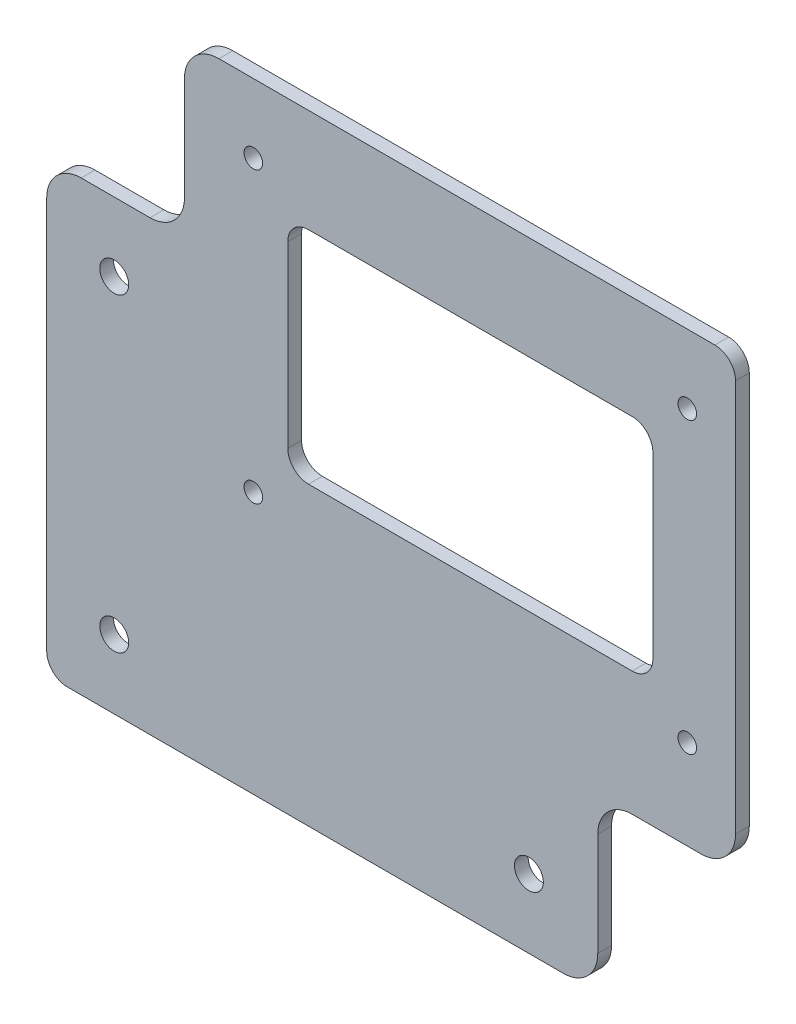
ISO-10303-21;
HEADER;
FILE_DESCRIPTION(('STEP AP214'),'2;1');
FILE_NAME('part.step','',(''),(''),'','','');
FILE_SCHEMA(('AUTOMOTIVE_DESIGN { 1 0 10303 214 1 1 1 1 }'));
ENDSEC;
DATA;
#1=APPLICATION_CONTEXT('core data for automotive mechanical design processes');
#2=APPLICATION_PROTOCOL_DEFINITION('international standard','automotive_design',2000,#1);
#3=PRODUCT_CONTEXT('',#1,'mechanical');
#4=PRODUCT('Part','Part','',(#3));
#5=PRODUCT_RELATED_PRODUCT_CATEGORY('part','',(#4));
#6=PRODUCT_DEFINITION_FORMATION('','',#4);
#7=PRODUCT_DEFINITION_CONTEXT('part definition',#1,'design');
#8=PRODUCT_DEFINITION('design','',#6,#7);
#9=PRODUCT_DEFINITION_SHAPE('','',#8);
#10=(LENGTH_UNIT() NAMED_UNIT(*) SI_UNIT(.MILLI.,.METRE.));
#11=(NAMED_UNIT(*) PLANE_ANGLE_UNIT() SI_UNIT($,.RADIAN.));
#12=(NAMED_UNIT(*) SI_UNIT($,.STERADIAN.) SOLID_ANGLE_UNIT());
#13=UNCERTAINTY_MEASURE_WITH_UNIT(LENGTH_MEASURE(1.E-05),#10,'distance_accuracy_value','');
#14=(GEOMETRIC_REPRESENTATION_CONTEXT(3) GLOBAL_UNCERTAINTY_ASSIGNED_CONTEXT((#13)) GLOBAL_UNIT_ASSIGNED_CONTEXT((#10,
#11,#12)) REPRESENTATION_CONTEXT('',''));
#15=CARTESIAN_POINT('',(0.,0.,0.));
#16=DIRECTION('',(0.,0.,1.));
#17=DIRECTION('',(1.,0.,0.));
#18=AXIS2_PLACEMENT_3D('',#15,#16,#17);
#19=CARTESIAN_POINT('',(0.,0.,2.));
#20=DIRECTION('',(1.,0.,0.));
#21=DIRECTION('',(0.,1.,0.));
#22=AXIS2_PLACEMENT_3D('',#19,#20,#21);
#23=PLANE('',#22);
#24=DIRECTION('',(0.,-1.,0.));
#25=VECTOR('',#24,1.);
#26=CARTESIAN_POINT('',(0.,0.,2.));
#27=LINE('',#26,#25);
#28=CARTESIAN_POINT('',(0.,60.,2.));
#29=VERTEX_POINT('',#28);
#30=CARTESIAN_POINT('',(0.,3.,2.));
#31=VERTEX_POINT('',#30);
#32=EDGE_CURVE('E308',#29,#31,#27,.T.);
#33=ORIENTED_EDGE('',*,*,#32,.F.);
#34=DIRECTION('',(0.,0.,1.));
#35=VECTOR('',#34,1.);
#36=CARTESIAN_POINT('',(0.,60.,2.));
#37=LINE('',#36,#35);
#38=CARTESIAN_POINT('',(0.,60.,0.));
#39=VERTEX_POINT('',#38);
#40=EDGE_CURVE('E402',#29,#39,#37,.F.);
#41=ORIENTED_EDGE('',*,*,#40,.T.);
#42=DIRECTION('',(0.,-1.,0.));
#43=VECTOR('',#42,1.);
#44=CARTESIAN_POINT('',(0.,0.,0.));
#45=LINE('',#44,#43);
#46=CARTESIAN_POINT('',(0.,3.,0.));
#47=VERTEX_POINT('',#46);
#48=EDGE_CURVE('E305',#39,#47,#45,.T.);
#49=ORIENTED_EDGE('',*,*,#48,.T.);
#50=DIRECTION('',(0.,0.,-1.));
#51=VECTOR('',#50,1.);
#52=CARTESIAN_POINT('',(0.,3.,2.));
#53=LINE('',#52,#51);
#54=EDGE_CURVE('E319',#47,#31,#53,.F.);
#55=ORIENTED_EDGE('',*,*,#54,.T.);
#56=EDGE_LOOP('',(#33,#41,#49,#55));
#57=FACE_BOUND('',#56,.T.);
#58=ADVANCED_FACE('F41',(#57),#23,.F.);
#59=CARTESIAN_POINT('',(0.,0.,2.));
#60=DIRECTION('',(0.,1.,0.));
#61=DIRECTION('',(0.,0.,1.));
#62=AXIS2_PLACEMENT_3D('',#59,#60,#61);
#63=PLANE('',#62);
#64=DIRECTION('',(1.,0.,0.));
#65=VECTOR('',#64,1.);
#66=CARTESIAN_POINT('',(0.,0.,0.));
#67=LINE('',#66,#65);
#68=CARTESIAN_POINT('',(3.,0.,0.));
#69=VERTEX_POINT('',#68);
#70=CARTESIAN_POINT('',(75.,0.,0.));
#71=VERTEX_POINT('',#70);
#72=EDGE_CURVE('E321',#69,#71,#67,.T.);
#73=ORIENTED_EDGE('',*,*,#72,.T.);
#74=DIRECTION('',(0.,0.,1.));
#75=VECTOR('',#74,1.);
#76=CARTESIAN_POINT('',(75.,0.,2.));
#77=LINE('',#76,#75);
#78=CARTESIAN_POINT('',(75.,0.,2.));
#79=VERTEX_POINT('',#78);
#80=EDGE_CURVE('E360',#71,#79,#77,.T.);
#81=ORIENTED_EDGE('',*,*,#80,.T.);
#82=DIRECTION('',(1.,0.,0.));
#83=VECTOR('',#82,1.);
#84=CARTESIAN_POINT('',(0.,0.,2.));
#85=LINE('',#84,#83);
#86=CARTESIAN_POINT('',(3.,0.,2.));
#87=VERTEX_POINT('',#86);
#88=EDGE_CURVE('E310',#87,#79,#85,.T.);
#89=ORIENTED_EDGE('',*,*,#88,.F.);
#90=DIRECTION('',(0.,0.,-1.));
#91=VECTOR('',#90,1.);
#92=CARTESIAN_POINT('',(3.,0.,2.));
#93=LINE('',#92,#91);
#94=EDGE_CURVE('E346',#87,#69,#93,.T.);
#95=ORIENTED_EDGE('',*,*,#94,.T.);
#96=EDGE_LOOP('',(#73,#81,#89,#95));
#97=FACE_BOUND('',#96,.T.);
#98=ADVANCED_FACE('F510',(#97),#63,.F.);
#99=CARTESIAN_POINT('',(100.,0.,2.));
#100=DIRECTION('',(-1.,0.,0.));
#101=DIRECTION('',(0.,-1.,0.));
#102=AXIS2_PLACEMENT_3D('',#99,#100,#101);
#103=PLANE('',#102);
#104=DIRECTION('',(0.,1.,0.));
#105=VECTOR('',#104,1.);
#106=CARTESIAN_POINT('',(100.,0.,2.));
#107=LINE('',#106,#105);
#108=CARTESIAN_POINT('',(100.,30.,2.));
#109=VERTEX_POINT('',#108);
#110=CARTESIAN_POINT('',(100.,87.,2.));
#111=VERTEX_POINT('',#110);
#112=EDGE_CURVE('E314',#109,#111,#107,.T.);
#113=ORIENTED_EDGE('',*,*,#112,.F.);
#114=DIRECTION('',(0.,0.,1.));
#115=VECTOR('',#114,1.);
#116=CARTESIAN_POINT('',(100.,30.,2.));
#117=LINE('',#116,#115);
#118=CARTESIAN_POINT('',(100.,30.,0.));
#119=VERTEX_POINT('',#118);
#120=EDGE_CURVE('E388',#109,#119,#117,.F.);
#121=ORIENTED_EDGE('',*,*,#120,.T.);
#122=DIRECTION('',(0.,1.,0.));
#123=VECTOR('',#122,1.);
#124=CARTESIAN_POINT('',(100.,0.,0.));
#125=LINE('',#124,#123);
#126=CARTESIAN_POINT('',(100.,87.,0.));
#127=VERTEX_POINT('',#126);
#128=EDGE_CURVE('E324',#119,#127,#125,.T.);
#129=ORIENTED_EDGE('',*,*,#128,.T.);
#130=DIRECTION('',(0.,0.,-1.));
#131=VECTOR('',#130,1.);
#132=CARTESIAN_POINT('',(100.,87.,2.));
#133=LINE('',#132,#131);
#134=EDGE_CURVE('E343',#127,#111,#133,.F.);
#135=ORIENTED_EDGE('',*,*,#134,.T.);
#136=EDGE_LOOP('',(#113,#121,#129,#135));
#137=FACE_BOUND('',#136,.T.);
#138=ADVANCED_FACE('F517',(#137),#103,.F.);
#139=CARTESIAN_POINT('',(0.,90.,2.));
#140=DIRECTION('',(0.,-1.,0.));
#141=DIRECTION('',(0.,0.,-1.));
#142=AXIS2_PLACEMENT_3D('',#139,#140,#141);
#143=PLANE('',#142);
#144=DIRECTION('',(-1.,0.,0.));
#145=VECTOR('',#144,1.);
#146=CARTESIAN_POINT('',(0.,90.,0.));
#147=LINE('',#146,#145);
#148=CARTESIAN_POINT('',(97.,90.,0.));
#149=VERTEX_POINT('',#148);
#150=CARTESIAN_POINT('',(25.,90.,0.));
#151=VERTEX_POINT('',#150);
#152=EDGE_CURVE('E311',#149,#151,#147,.T.);
#153=ORIENTED_EDGE('',*,*,#152,.T.);
#154=DIRECTION('',(0.,0.,1.));
#155=VECTOR('',#154,1.);
#156=CARTESIAN_POINT('',(25.,90.,2.));
#157=LINE('',#156,#155);
#158=CARTESIAN_POINT('',(25.,90.,2.));
#159=VERTEX_POINT('',#158);
#160=EDGE_CURVE('E390',#151,#159,#157,.T.);
#161=ORIENTED_EDGE('',*,*,#160,.T.);
#162=DIRECTION('',(-1.,0.,0.));
#163=VECTOR('',#162,1.);
#164=CARTESIAN_POINT('',(0.,90.,2.));
#165=LINE('',#164,#163);
#166=CARTESIAN_POINT('',(97.,90.,2.));
#167=VERTEX_POINT('',#166);
#168=EDGE_CURVE('E316',#167,#159,#165,.T.);
#169=ORIENTED_EDGE('',*,*,#168,.F.);
#170=DIRECTION('',(0.,0.,-1.));
#171=VECTOR('',#170,1.);
#172=CARTESIAN_POINT('',(97.,90.,2.));
#173=LINE('',#172,#171);
#174=EDGE_CURVE('E336',#167,#149,#173,.T.);
#175=ORIENTED_EDGE('',*,*,#174,.T.);
#176=EDGE_LOOP('',(#153,#161,#169,#175));
#177=FACE_BOUND('',#176,.T.);
#178=ADVANCED_FACE('F432',(#177),#143,.F.);
#179=CARTESIAN_POINT('',(0.,0.,2.));
#180=DIRECTION('',(0.,0.,-1.));
#181=DIRECTION('',(-1.,0.,0.));
#182=AXIS2_PLACEMENT_3D('',#179,#180,#181);
#183=PLANE('',#182);
#184=DIRECTION('',(1.,0.,0.));
#185=VECTOR('',#184,1.);
#186=CARTESIAN_POINT('',(38.,43.,2.));
#187=LINE('',#186,#185);
#188=CARTESIAN_POINT('',(38.,43.,2.));
#189=VERTEX_POINT('',#188);
#190=CARTESIAN_POINT('',(85.,43.,2.));
#191=VERTEX_POINT('',#190);
#192=EDGE_CURVE('E252',#189,#191,#187,.T.);
#193=ORIENTED_EDGE('',*,*,#192,.F.);
#194=CARTESIAN_POINT('',(38.,46.,2.));
#195=DIRECTION('',(0.,0.,1.));
#196=DIRECTION('',(-1.,0.,0.));
#197=AXIS2_PLACEMENT_3D('',#194,#195,#196);
#198=CIRCLE('',#197,3.00000000000001);
#199=CARTESIAN_POINT('',(35.,46.,2.));
#200=VERTEX_POINT('',#199);
#201=EDGE_CURVE('E210',#200,#189,#198,.T.);
#202=ORIENTED_EDGE('',*,*,#201,.F.);
#203=DIRECTION('',(0.,-1.,0.));
#204=VECTOR('',#203,1.);
#205=CARTESIAN_POINT('',(35.,72.,2.));
#206=LINE('',#205,#204);
#207=CARTESIAN_POINT('',(35.,72.,2.));
#208=VERTEX_POINT('',#207);
#209=EDGE_CURVE('E229',#208,#200,#206,.T.);
#210=ORIENTED_EDGE('',*,*,#209,.F.);
#211=CARTESIAN_POINT('',(38.,72.,2.));
#212=DIRECTION('',(0.,0.,1.));
#213=DIRECTION('',(1.,0.,0.));
#214=AXIS2_PLACEMENT_3D('',#211,#212,#213);
#215=CIRCLE('',#214,3.);
#216=CARTESIAN_POINT('',(38.,75.,2.));
#217=VERTEX_POINT('',#216);
#218=EDGE_CURVE('E232',#217,#208,#215,.T.);
#219=ORIENTED_EDGE('',*,*,#218,.F.);
#220=DIRECTION('',(-1.,0.,0.));
#221=VECTOR('',#220,1.);
#222=CARTESIAN_POINT('',(38.,75.,2.));
#223=LINE('',#222,#221);
#224=CARTESIAN_POINT('',(85.,75.,2.));
#225=VERTEX_POINT('',#224);
#226=EDGE_CURVE('E264',#225,#217,#223,.T.);
#227=ORIENTED_EDGE('',*,*,#226,.F.);
#228=CARTESIAN_POINT('',(85.,72.,2.));
#229=DIRECTION('',(0.,0.,1.));
#230=DIRECTION('',(1.,0.,0.));
#231=AXIS2_PLACEMENT_3D('',#228,#229,#230);
#232=CIRCLE('',#231,3.);
#233=CARTESIAN_POINT('',(88.,72.,2.));
#234=VERTEX_POINT('',#233);
#235=EDGE_CURVE('E261',#234,#225,#232,.T.);
#236=ORIENTED_EDGE('',*,*,#235,.F.);
#237=DIRECTION('',(0.,1.,0.));
#238=VECTOR('',#237,1.);
#239=CARTESIAN_POINT('',(88.,72.,2.));
#240=LINE('',#239,#238);
#241=CARTESIAN_POINT('',(88.,46.,2.));
#242=VERTEX_POINT('',#241);
#243=EDGE_CURVE('E258',#242,#234,#240,.T.);
#244=ORIENTED_EDGE('',*,*,#243,.F.);
#245=CARTESIAN_POINT('',(85.,46.,2.));
#246=DIRECTION('',(0.,0.,1.));
#247=DIRECTION('',(1.,0.,0.));
#248=AXIS2_PLACEMENT_3D('',#245,#246,#247);
#249=CIRCLE('',#248,3.00000000000001);
#250=EDGE_CURVE('E255',#191,#242,#249,.T.);
#251=ORIENTED_EDGE('',*,*,#250,.F.);
#252=EDGE_LOOP('',(#193,#202,#210,#219,#227,#236,#244,#251));
#253=FACE_BOUND('',#252,.T.);
#254=CARTESIAN_POINT('',(30.,38.,2.));
#255=DIRECTION('',(0.,0.,1.));
#256=DIRECTION('',(1.,0.,0.));
#257=AXIS2_PLACEMENT_3D('',#254,#255,#256);
#258=CIRCLE('',#257,1.35000000000001);
#259=CARTESIAN_POINT('',(31.35,38.,2.));
#260=VERTEX_POINT('',#259);
#261=EDGE_CURVE('E235',#260,#260,#258,.T.);
#262=ORIENTED_EDGE('',*,*,#261,.F.);
#263=EDGE_LOOP('',(#262));
#264=FACE_BOUND('',#263,.T.);
#265=CARTESIAN_POINT('',(93.,38.,2.));
#266=DIRECTION('',(0.,0.,1.));
#267=DIRECTION('',(1.,0.,0.));
#268=AXIS2_PLACEMENT_3D('',#265,#266,#267);
#269=CIRCLE('',#268,1.35000000000001);
#270=CARTESIAN_POINT('',(94.35,38.,2.));
#271=VERTEX_POINT('',#270);
#272=EDGE_CURVE('E468',#271,#271,#269,.T.);
#273=ORIENTED_EDGE('',*,*,#272,.F.);
#274=EDGE_LOOP('',(#273));
#275=FACE_BOUND('',#274,.T.);
#276=CARTESIAN_POINT('',(93.,80.,2.));
#277=DIRECTION('',(0.,0.,1.));
#278=DIRECTION('',(1.,0.,0.));
#279=AXIS2_PLACEMENT_3D('',#276,#277,#278);
#280=CIRCLE('',#279,1.35000000000001);
#281=CARTESIAN_POINT('',(94.35,80.,2.));
#282=VERTEX_POINT('',#281);
#283=EDGE_CURVE('E462',#282,#282,#280,.T.);
#284=ORIENTED_EDGE('',*,*,#283,.F.);
#285=EDGE_LOOP('',(#284));
#286=FACE_BOUND('',#285,.T.);
#287=CARTESIAN_POINT('',(30.,80.,2.));
#288=DIRECTION('',(0.,0.,1.));
#289=DIRECTION('',(1.,0.,0.));
#290=AXIS2_PLACEMENT_3D('',#287,#288,#289);
#291=CIRCLE('',#290,1.35000000000001);
#292=CARTESIAN_POINT('',(31.35,80.,2.));
#293=VERTEX_POINT('',#292);
#294=EDGE_CURVE('E286',#293,#293,#291,.T.);
#295=ORIENTED_EDGE('',*,*,#294,.F.);
#296=EDGE_LOOP('',(#295));
#297=FACE_BOUND('',#296,.T.);
#298=CARTESIAN_POINT('',(70.,10.,2.));
#299=DIRECTION('',(0.,0.,1.));
#300=DIRECTION('',(1.,0.,0.));
#301=AXIS2_PLACEMENT_3D('',#298,#299,#300);
#302=CIRCLE('',#301,2.09999999999999);
#303=CARTESIAN_POINT('',(72.1,10.,2.));
#304=VERTEX_POINT('',#303);
#305=EDGE_CURVE('E285',#304,#304,#302,.T.);
#306=ORIENTED_EDGE('',*,*,#305,.F.);
#307=EDGE_LOOP('',(#306));
#308=FACE_BOUND('',#307,.T.);
#309=CARTESIAN_POINT('',(9.79999999999997,55.,2.));
#310=DIRECTION('',(0.,0.,1.));
#311=DIRECTION('',(1.,0.,0.));
#312=AXIS2_PLACEMENT_3D('',#309,#310,#311);
#313=CIRCLE('',#312,2.1);
#314=CARTESIAN_POINT('',(11.9,55.,2.));
#315=VERTEX_POINT('',#314);
#316=EDGE_CURVE('E294',#315,#315,#313,.T.);
#317=ORIENTED_EDGE('',*,*,#316,.F.);
#318=EDGE_LOOP('',(#317));
#319=FACE_BOUND('',#318,.T.);
#320=CARTESIAN_POINT('',(9.79999999999997,9.99999999999999,2.));
#321=DIRECTION('',(0.,0.,1.));
#322=DIRECTION('',(1.,0.,0.));
#323=AXIS2_PLACEMENT_3D('',#320,#321,#322);
#324=CIRCLE('',#323,2.1);
#325=CARTESIAN_POINT('',(11.9,9.99999999999999,2.));
#326=VERTEX_POINT('',#325);
#327=EDGE_CURVE('E293',#326,#326,#324,.T.);
#328=ORIENTED_EDGE('',*,*,#327,.F.);
#329=EDGE_LOOP('',(#328));
#330=FACE_BOUND('',#329,.T.);
#331=ORIENTED_EDGE('',*,*,#88,.T.);
#332=CARTESIAN_POINT('',(75.,5.,2.));
#333=DIRECTION('',(0.,0.,-1.));
#334=DIRECTION('',(-1.,0.,0.));
#335=AXIS2_PLACEMENT_3D('',#332,#333,#334);
#336=CIRCLE('',#335,5.);
#337=CARTESIAN_POINT('',(80.,5.,2.));
#338=VERTEX_POINT('',#337);
#339=EDGE_CURVE('E369',#79,#338,#336,.F.);
#340=ORIENTED_EDGE('',*,*,#339,.T.);
#341=DIRECTION('',(0.,-1.,0.));
#342=VECTOR('',#341,1.);
#343=CARTESIAN_POINT('',(80.,25.,2.));
#344=LINE('',#343,#342);
#345=CARTESIAN_POINT('',(80.,20.,2.));
#346=VERTEX_POINT('',#345);
#347=EDGE_CURVE('E454',#346,#338,#344,.T.);
#348=ORIENTED_EDGE('',*,*,#347,.F.);
#349=CARTESIAN_POINT('',(85.,20.,2.));
#350=DIRECTION('',(0.,0.,-1.));
#351=DIRECTION('',(-1.,0.,0.));
#352=AXIS2_PLACEMENT_3D('',#349,#350,#351);
#353=CIRCLE('',#352,5.);
#354=CARTESIAN_POINT('',(85.,25.,2.));
#355=VERTEX_POINT('',#354);
#356=EDGE_CURVE('E404',#346,#355,#353,.T.);
#357=ORIENTED_EDGE('',*,*,#356,.T.);
#358=DIRECTION('',(-1.,0.,0.));
#359=VECTOR('',#358,1.);
#360=CARTESIAN_POINT('',(100.,25.,2.));
#361=LINE('',#360,#359);
#362=CARTESIAN_POINT('',(95.,25.,2.));
#363=VERTEX_POINT('',#362);
#364=EDGE_CURVE('E417',#363,#355,#361,.T.);
#365=ORIENTED_EDGE('',*,*,#364,.F.);
#366=CARTESIAN_POINT('',(95.,30.,2.));
#367=DIRECTION('',(0.,0.,-1.));
#368=DIRECTION('',(-1.,0.,0.));
#369=AXIS2_PLACEMENT_3D('',#366,#367,#368);
#370=CIRCLE('',#369,5.);
#371=EDGE_CURVE('E367',#363,#109,#370,.F.);
#372=ORIENTED_EDGE('',*,*,#371,.T.);
#373=ORIENTED_EDGE('',*,*,#112,.T.);
#374=CARTESIAN_POINT('',(97.,87.,2.));
#375=DIRECTION('',(0.,0.,-1.));
#376=DIRECTION('',(-1.,0.,0.));
#377=AXIS2_PLACEMENT_3D('',#374,#375,#376);
#378=CIRCLE('',#377,3.);
#379=EDGE_CURVE('E341',#111,#167,#378,.F.);
#380=ORIENTED_EDGE('',*,*,#379,.T.);
#381=ORIENTED_EDGE('',*,*,#168,.T.);
#382=CARTESIAN_POINT('',(25.,85.,2.));
#383=DIRECTION('',(0.,0.,-1.));
#384=DIRECTION('',(-1.,0.,0.));
#385=AXIS2_PLACEMENT_3D('',#382,#383,#384);
#386=CIRCLE('',#385,5.);
#387=CARTESIAN_POINT('',(20.,85.,2.));
#388=VERTEX_POINT('',#387);
#389=EDGE_CURVE('E365',#159,#388,#386,.F.);
#390=ORIENTED_EDGE('',*,*,#389,.T.);
#391=DIRECTION('',(0.,1.,0.));
#392=VECTOR('',#391,1.);
#393=CARTESIAN_POINT('',(20.,90.,2.));
#394=LINE('',#393,#392);
#395=CARTESIAN_POINT('',(20.,70.,2.));
#396=VERTEX_POINT('',#395);
#397=EDGE_CURVE('E253',#396,#388,#394,.T.);
#398=ORIENTED_EDGE('',*,*,#397,.F.);
#399=CARTESIAN_POINT('',(15.,70.,2.));
#400=DIRECTION('',(0.,0.,-1.));
#401=DIRECTION('',(-1.,0.,0.));
#402=AXIS2_PLACEMENT_3D('',#399,#400,#401);
#403=CIRCLE('',#402,5.);
#404=CARTESIAN_POINT('',(15.,65.,2.));
#405=VERTEX_POINT('',#404);
#406=EDGE_CURVE('E49',#396,#405,#403,.T.);
#407=ORIENTED_EDGE('',*,*,#406,.T.);
#408=DIRECTION('',(1.,0.,0.));
#409=VECTOR('',#408,1.);
#410=CARTESIAN_POINT('',(0.,65.,2.));
#411=LINE('',#410,#409);
#412=CARTESIAN_POINT('',(4.99999999999999,65.,2.));
#413=VERTEX_POINT('',#412);
#414=EDGE_CURVE('E411',#413,#405,#411,.T.);
#415=ORIENTED_EDGE('',*,*,#414,.F.);
#416=CARTESIAN_POINT('',(4.99999999999999,60.,2.));
#417=DIRECTION('',(0.,0.,-1.));
#418=DIRECTION('',(-1.,0.,0.));
#419=AXIS2_PLACEMENT_3D('',#416,#417,#418);
#420=CIRCLE('',#419,5.);
#421=EDGE_CURVE('E363',#413,#29,#420,.F.);
#422=ORIENTED_EDGE('',*,*,#421,.T.);
#423=ORIENTED_EDGE('',*,*,#32,.T.);
#424=CARTESIAN_POINT('',(3.,3.,2.));
#425=DIRECTION('',(0.,0.,-1.));
#426=DIRECTION('',(-1.,0.,0.));
#427=AXIS2_PLACEMENT_3D('',#424,#425,#426);
#428=CIRCLE('',#427,3.);
#429=EDGE_CURVE('E339',#31,#87,#428,.F.);
#430=ORIENTED_EDGE('',*,*,#429,.T.);
#431=EDGE_LOOP('',(#331,#340,#348,#357,#365,#372,#373,#380,#381,#390,#398,#407,#415,#422,#423,#430));
#432=FACE_BOUND('',#431,.T.);
#433=ADVANCED_FACE('F410',(#253,#264,#275,#286,#297,#308,#319,#330,#432),#183,.F.);
#434=CARTESIAN_POINT('',(0.,0.,0.));
#435=DIRECTION('',(0.,0.,-1.));
#436=DIRECTION('',(-1.,0.,0.));
#437=AXIS2_PLACEMENT_3D('',#434,#435,#436);
#438=PLANE('',#437);
#439=DIRECTION('',(0.,1.,0.));
#440=VECTOR('',#439,1.);
#441=CARTESIAN_POINT('',(80.,0.,0.));
#442=LINE('',#441,#440);
#443=CARTESIAN_POINT('',(80.,5.,0.));
#444=VERTEX_POINT('',#443);
#445=CARTESIAN_POINT('',(80.,20.,0.));
#446=VERTEX_POINT('',#445);
#447=EDGE_CURVE('E352',#444,#446,#442,.T.);
#448=ORIENTED_EDGE('',*,*,#447,.F.);
#449=CARTESIAN_POINT('',(75.,5.,0.));
#450=DIRECTION('',(0.,0.,-1.));
#451=DIRECTION('',(-1.,0.,0.));
#452=AXIS2_PLACEMENT_3D('',#449,#450,#451);
#453=CIRCLE('',#452,5.);
#454=EDGE_CURVE('E381',#444,#71,#453,.T.);
#455=ORIENTED_EDGE('',*,*,#454,.T.);
#456=ORIENTED_EDGE('',*,*,#72,.F.);
#457=CARTESIAN_POINT('',(3.,3.,0.));
#458=DIRECTION('',(0.,0.,-1.));
#459=DIRECTION('',(-1.,0.,0.));
#460=AXIS2_PLACEMENT_3D('',#457,#458,#459);
#461=CIRCLE('',#460,3.);
#462=EDGE_CURVE('E330',#69,#47,#461,.T.);
#463=ORIENTED_EDGE('',*,*,#462,.T.);
#464=ORIENTED_EDGE('',*,*,#48,.F.);
#465=CARTESIAN_POINT('',(4.99999999999999,60.,0.));
#466=DIRECTION('',(0.,0.,-1.));
#467=DIRECTION('',(-1.,0.,0.));
#468=AXIS2_PLACEMENT_3D('',#465,#466,#467);
#469=CIRCLE('',#468,5.);
#470=CARTESIAN_POINT('',(4.99999999999999,65.,0.));
#471=VERTEX_POINT('',#470);
#472=EDGE_CURVE('E56',#39,#471,#469,.T.);
#473=ORIENTED_EDGE('',*,*,#472,.T.);
#474=DIRECTION('',(-1.,0.,0.));
#475=VECTOR('',#474,1.);
#476=CARTESIAN_POINT('',(0.,65.,0.));
#477=LINE('',#476,#475);
#478=CARTESIAN_POINT('',(15.,65.,0.));
#479=VERTEX_POINT('',#478);
#480=EDGE_CURVE('E355',#479,#471,#477,.T.);
#481=ORIENTED_EDGE('',*,*,#480,.F.);
#482=CARTESIAN_POINT('',(15.,70.,0.));
#483=DIRECTION('',(0.,0.,-1.));
#484=DIRECTION('',(-1.,0.,0.));
#485=AXIS2_PLACEMENT_3D('',#482,#483,#484);
#486=CIRCLE('',#485,5.);
#487=CARTESIAN_POINT('',(20.,70.,0.));
#488=VERTEX_POINT('',#487);
#489=EDGE_CURVE('E11',#479,#488,#486,.F.);
#490=ORIENTED_EDGE('',*,*,#489,.T.);
#491=DIRECTION('',(0.,-1.,0.));
#492=VECTOR('',#491,1.);
#493=CARTESIAN_POINT('',(20.,0.,0.));
#494=LINE('',#493,#492);
#495=CARTESIAN_POINT('',(20.,85.,0.));
#496=VERTEX_POINT('',#495);
#497=EDGE_CURVE('E357',#496,#488,#494,.T.);
#498=ORIENTED_EDGE('',*,*,#497,.F.);
#499=CARTESIAN_POINT('',(25.,85.,0.));
#500=DIRECTION('',(0.,0.,-1.));
#501=DIRECTION('',(-1.,0.,0.));
#502=AXIS2_PLACEMENT_3D('',#499,#500,#501);
#503=CIRCLE('',#502,5.);
#504=EDGE_CURVE('E377',#496,#151,#503,.T.);
#505=ORIENTED_EDGE('',*,*,#504,.T.);
#506=ORIENTED_EDGE('',*,*,#152,.F.);
#507=CARTESIAN_POINT('',(97.,87.,0.));
#508=DIRECTION('',(0.,0.,-1.));
#509=DIRECTION('',(-1.,0.,0.));
#510=AXIS2_PLACEMENT_3D('',#507,#508,#509);
#511=CIRCLE('',#510,3.);
#512=EDGE_CURVE('E333',#149,#127,#511,.T.);
#513=ORIENTED_EDGE('',*,*,#512,.T.);
#514=ORIENTED_EDGE('',*,*,#128,.F.);
#515=CARTESIAN_POINT('',(95.,30.,0.));
#516=DIRECTION('',(0.,0.,-1.));
#517=DIRECTION('',(-1.,0.,0.));
#518=AXIS2_PLACEMENT_3D('',#515,#516,#517);
#519=CIRCLE('',#518,5.);
#520=CARTESIAN_POINT('',(95.,25.,0.));
#521=VERTEX_POINT('',#520);
#522=EDGE_CURVE('E379',#119,#521,#519,.T.);
#523=ORIENTED_EDGE('',*,*,#522,.T.);
#524=DIRECTION('',(1.,0.,0.));
#525=VECTOR('',#524,1.);
#526=CARTESIAN_POINT('',(0.,25.,0.));
#527=LINE('',#526,#525);
#528=CARTESIAN_POINT('',(85.,25.,0.));
#529=VERTEX_POINT('',#528);
#530=EDGE_CURVE('E349',#529,#521,#527,.T.);
#531=ORIENTED_EDGE('',*,*,#530,.F.);
#532=CARTESIAN_POINT('',(85.,20.,0.));
#533=DIRECTION('',(0.,0.,-1.));
#534=DIRECTION('',(-1.,0.,0.));
#535=AXIS2_PLACEMENT_3D('',#532,#533,#534);
#536=CIRCLE('',#535,5.);
#537=EDGE_CURVE('E406',#529,#446,#536,.F.);
#538=ORIENTED_EDGE('',*,*,#537,.T.);
#539=EDGE_LOOP('',(#448,#455,#456,#463,#464,#473,#481,#490,#498,#505,#506,#513,#514,#523,#531,#538));
#540=FACE_BOUND('',#539,.T.);
#541=CARTESIAN_POINT('',(38.,46.,0.));
#542=DIRECTION('',(0.,0.,1.));
#543=DIRECTION('',(-1.,0.,0.));
#544=AXIS2_PLACEMENT_3D('',#541,#542,#543);
#545=CIRCLE('',#544,3.00000000000001);
#546=CARTESIAN_POINT('',(35.,46.,0.));
#547=VERTEX_POINT('',#546);
#548=CARTESIAN_POINT('',(38.,43.,0.));
#549=VERTEX_POINT('',#548);
#550=EDGE_CURVE('E207',#547,#549,#545,.T.);
#551=ORIENTED_EDGE('',*,*,#550,.T.);
#552=DIRECTION('',(1.,0.,0.));
#553=VECTOR('',#552,1.);
#554=CARTESIAN_POINT('',(38.,43.,0.));
#555=LINE('',#554,#553);
#556=CARTESIAN_POINT('',(85.,43.,0.));
#557=VERTEX_POINT('',#556);
#558=EDGE_CURVE('E219',#549,#557,#555,.T.);
#559=ORIENTED_EDGE('',*,*,#558,.T.);
#560=CARTESIAN_POINT('',(85.,46.,0.));
#561=DIRECTION('',(0.,0.,1.));
#562=DIRECTION('',(1.,0.,0.));
#563=AXIS2_PLACEMENT_3D('',#560,#561,#562);
#564=CIRCLE('',#563,3.00000000000001);
#565=CARTESIAN_POINT('',(88.,46.,0.));
#566=VERTEX_POINT('',#565);
#567=EDGE_CURVE('E223',#557,#566,#564,.T.);
#568=ORIENTED_EDGE('',*,*,#567,.T.);
#569=DIRECTION('',(0.,1.,0.));
#570=VECTOR('',#569,1.);
#571=CARTESIAN_POINT('',(88.,72.,0.));
#572=LINE('',#571,#570);
#573=CARTESIAN_POINT('',(88.,72.,0.));
#574=VERTEX_POINT('',#573);
#575=EDGE_CURVE('E239',#566,#574,#572,.T.);
#576=ORIENTED_EDGE('',*,*,#575,.T.);
#577=CARTESIAN_POINT('',(85.,72.,0.));
#578=DIRECTION('',(0.,0.,1.));
#579=DIRECTION('',(1.,0.,0.));
#580=AXIS2_PLACEMENT_3D('',#577,#578,#579);
#581=CIRCLE('',#580,3.);
#582=CARTESIAN_POINT('',(85.,75.,0.));
#583=VERTEX_POINT('',#582);
#584=EDGE_CURVE('E242',#574,#583,#581,.T.);
#585=ORIENTED_EDGE('',*,*,#584,.T.);
#586=DIRECTION('',(-1.,0.,0.));
#587=VECTOR('',#586,1.);
#588=CARTESIAN_POINT('',(38.,75.,0.));
#589=LINE('',#588,#587);
#590=CARTESIAN_POINT('',(38.,75.,0.));
#591=VERTEX_POINT('',#590);
#592=EDGE_CURVE('E245',#583,#591,#589,.T.);
#593=ORIENTED_EDGE('',*,*,#592,.T.);
#594=CARTESIAN_POINT('',(38.,72.,0.));
#595=DIRECTION('',(0.,0.,1.));
#596=DIRECTION('',(1.,0.,0.));
#597=AXIS2_PLACEMENT_3D('',#594,#595,#596);
#598=CIRCLE('',#597,3.);
#599=CARTESIAN_POINT('',(35.,72.,0.));
#600=VERTEX_POINT('',#599);
#601=EDGE_CURVE('E248',#591,#600,#598,.T.);
#602=ORIENTED_EDGE('',*,*,#601,.T.);
#603=DIRECTION('',(0.,-1.,0.));
#604=VECTOR('',#603,1.);
#605=CARTESIAN_POINT('',(35.,72.,0.));
#606=LINE('',#605,#604);
#607=EDGE_CURVE('E215',#600,#547,#606,.T.);
#608=ORIENTED_EDGE('',*,*,#607,.T.);
#609=EDGE_LOOP('',(#551,#559,#568,#576,#585,#593,#602,#608));
#610=FACE_BOUND('',#609,.T.);
#611=CARTESIAN_POINT('',(30.,38.,0.));
#612=DIRECTION('',(0.,0.,1.));
#613=DIRECTION('',(1.,0.,0.));
#614=AXIS2_PLACEMENT_3D('',#611,#612,#613);
#615=CIRCLE('',#614,1.35000000000001);
#616=CARTESIAN_POINT('',(31.35,38.,0.));
#617=VERTEX_POINT('',#616);
#618=EDGE_CURVE('E470',#617,#617,#615,.T.);
#619=ORIENTED_EDGE('',*,*,#618,.T.);
#620=EDGE_LOOP('',(#619));
#621=FACE_BOUND('',#620,.T.);
#622=CARTESIAN_POINT('',(93.,38.,0.));
#623=DIRECTION('',(0.,0.,1.));
#624=DIRECTION('',(1.,0.,0.));
#625=AXIS2_PLACEMENT_3D('',#622,#623,#624);
#626=CIRCLE('',#625,1.35000000000001);
#627=CARTESIAN_POINT('',(94.35,38.,0.));
#628=VERTEX_POINT('',#627);
#629=EDGE_CURVE('E465',#628,#628,#626,.T.);
#630=ORIENTED_EDGE('',*,*,#629,.T.);
#631=EDGE_LOOP('',(#630));
#632=FACE_BOUND('',#631,.T.);
#633=CARTESIAN_POINT('',(93.,80.,0.));
#634=DIRECTION('',(0.,0.,1.));
#635=DIRECTION('',(1.,0.,0.));
#636=AXIS2_PLACEMENT_3D('',#633,#634,#635);
#637=CIRCLE('',#636,1.35000000000001);
#638=CARTESIAN_POINT('',(94.35,80.,0.));
#639=VERTEX_POINT('',#638);
#640=EDGE_CURVE('E289',#639,#639,#637,.T.);
#641=ORIENTED_EDGE('',*,*,#640,.T.);
#642=EDGE_LOOP('',(#641));
#643=FACE_BOUND('',#642,.T.);
#644=CARTESIAN_POINT('',(30.,80.,0.));
#645=DIRECTION('',(0.,0.,1.));
#646=DIRECTION('',(1.,0.,0.));
#647=AXIS2_PLACEMENT_3D('',#644,#645,#646);
#648=CIRCLE('',#647,1.35000000000001);
#649=CARTESIAN_POINT('',(31.35,80.,0.));
#650=VERTEX_POINT('',#649);
#651=EDGE_CURVE('E282',#650,#650,#648,.T.);
#652=ORIENTED_EDGE('',*,*,#651,.T.);
#653=EDGE_LOOP('',(#652));
#654=FACE_BOUND('',#653,.T.);
#655=CARTESIAN_POINT('',(70.,10.,0.));
#656=DIRECTION('',(0.,0.,1.));
#657=DIRECTION('',(1.,0.,0.));
#658=AXIS2_PLACEMENT_3D('',#655,#656,#657);
#659=CIRCLE('',#658,2.09999999999999);
#660=CARTESIAN_POINT('',(72.1,10.,0.));
#661=VERTEX_POINT('',#660);
#662=EDGE_CURVE('E297',#661,#661,#659,.T.);
#663=ORIENTED_EDGE('',*,*,#662,.T.);
#664=EDGE_LOOP('',(#663));
#665=FACE_BOUND('',#664,.T.);
#666=CARTESIAN_POINT('',(9.79999999999997,55.,0.));
#667=DIRECTION('',(0.,0.,1.));
#668=DIRECTION('',(1.,0.,0.));
#669=AXIS2_PLACEMENT_3D('',#666,#667,#668);
#670=CIRCLE('',#669,2.1);
#671=CARTESIAN_POINT('',(11.9,55.,0.));
#672=VERTEX_POINT('',#671);
#673=EDGE_CURVE('E290',#672,#672,#670,.T.);
#674=ORIENTED_EDGE('',*,*,#673,.T.);
#675=EDGE_LOOP('',(#674));
#676=FACE_BOUND('',#675,.T.);
#677=CARTESIAN_POINT('',(9.79999999999997,9.99999999999999,0.));
#678=DIRECTION('',(0.,0.,1.));
#679=DIRECTION('',(1.,0.,0.));
#680=AXIS2_PLACEMENT_3D('',#677,#678,#679);
#681=CIRCLE('',#680,2.1);
#682=CARTESIAN_POINT('',(11.9,9.99999999999999,0.));
#683=VERTEX_POINT('',#682);
#684=EDGE_CURVE('E302',#683,#683,#681,.T.);
#685=ORIENTED_EDGE('',*,*,#684,.T.);
#686=EDGE_LOOP('',(#685));
#687=FACE_BOUND('',#686,.T.);
#688=ADVANCED_FACE('F225',(#540,#610,#621,#632,#643,#654,#665,#676,#687),#438,.T.);
#689=CARTESIAN_POINT('',(9.79999999999997,9.99999999999999,0.));
#690=DIRECTION('',(0.,0.,1.));
#691=DIRECTION('',(1.,0.,0.));
#692=AXIS2_PLACEMENT_3D('',#689,#690,#691);
#693=CYLINDRICAL_SURFACE('',#692,2.1);
#694=ORIENTED_EDGE('',*,*,#684,.F.);
#695=EDGE_LOOP('',(#694));
#696=FACE_BOUND('',#695,.T.);
#697=ORIENTED_EDGE('',*,*,#327,.T.);
#698=EDGE_LOOP('',(#697));
#699=FACE_BOUND('',#698,.T.);
#700=ADVANCED_FACE('F494',(#696,#699),#693,.F.);
#701=CARTESIAN_POINT('',(9.79999999999997,55.,0.));
#702=DIRECTION('',(0.,0.,1.));
#703=DIRECTION('',(1.,0.,0.));
#704=AXIS2_PLACEMENT_3D('',#701,#702,#703);
#705=CYLINDRICAL_SURFACE('',#704,2.1);
#706=ORIENTED_EDGE('',*,*,#673,.F.);
#707=EDGE_LOOP('',(#706));
#708=FACE_BOUND('',#707,.T.);
#709=ORIENTED_EDGE('',*,*,#316,.T.);
#710=EDGE_LOOP('',(#709));
#711=FACE_BOUND('',#710,.T.);
#712=ADVANCED_FACE('F496',(#708,#711),#705,.F.);
#713=CARTESIAN_POINT('',(70.,10.,0.));
#714=DIRECTION('',(0.,0.,1.));
#715=DIRECTION('',(1.,0.,0.));
#716=AXIS2_PLACEMENT_3D('',#713,#714,#715);
#717=CYLINDRICAL_SURFACE('',#716,2.09999999999999);
#718=ORIENTED_EDGE('',*,*,#662,.F.);
#719=EDGE_LOOP('',(#718));
#720=FACE_BOUND('',#719,.T.);
#721=ORIENTED_EDGE('',*,*,#305,.T.);
#722=EDGE_LOOP('',(#721));
#723=FACE_BOUND('',#722,.T.);
#724=ADVANCED_FACE('F502',(#720,#723),#717,.F.);
#725=CARTESIAN_POINT('',(30.,80.,0.));
#726=DIRECTION('',(0.,0.,1.));
#727=DIRECTION('',(1.,0.,0.));
#728=AXIS2_PLACEMENT_3D('',#725,#726,#727);
#729=CYLINDRICAL_SURFACE('',#728,1.35000000000001);
#730=ORIENTED_EDGE('',*,*,#651,.F.);
#731=EDGE_LOOP('',(#730));
#732=FACE_BOUND('',#731,.T.);
#733=ORIENTED_EDGE('',*,*,#294,.T.);
#734=EDGE_LOOP('',(#733));
#735=FACE_BOUND('',#734,.T.);
#736=ADVANCED_FACE('F571',(#732,#735),#729,.F.);
#737=CARTESIAN_POINT('',(93.,80.,0.));
#738=DIRECTION('',(0.,0.,1.));
#739=DIRECTION('',(1.,0.,0.));
#740=AXIS2_PLACEMENT_3D('',#737,#738,#739);
#741=CYLINDRICAL_SURFACE('',#740,1.35000000000001);
#742=ORIENTED_EDGE('',*,*,#640,.F.);
#743=EDGE_LOOP('',(#742));
#744=FACE_BOUND('',#743,.T.);
#745=ORIENTED_EDGE('',*,*,#283,.T.);
#746=EDGE_LOOP('',(#745));
#747=FACE_BOUND('',#746,.T.);
#748=ADVANCED_FACE('F567',(#744,#747),#741,.F.);
#749=CARTESIAN_POINT('',(93.,38.,0.));
#750=DIRECTION('',(0.,0.,1.));
#751=DIRECTION('',(1.,0.,0.));
#752=AXIS2_PLACEMENT_3D('',#749,#750,#751);
#753=CYLINDRICAL_SURFACE('',#752,1.35000000000001);
#754=ORIENTED_EDGE('',*,*,#629,.F.);
#755=EDGE_LOOP('',(#754));
#756=FACE_BOUND('',#755,.T.);
#757=ORIENTED_EDGE('',*,*,#272,.T.);
#758=EDGE_LOOP('',(#757));
#759=FACE_BOUND('',#758,.T.);
#760=ADVANCED_FACE('F570',(#756,#759),#753,.F.);
#761=CARTESIAN_POINT('',(30.,38.,0.));
#762=DIRECTION('',(0.,0.,1.));
#763=DIRECTION('',(1.,0.,0.));
#764=AXIS2_PLACEMENT_3D('',#761,#762,#763);
#765=CYLINDRICAL_SURFACE('',#764,1.35000000000001);
#766=ORIENTED_EDGE('',*,*,#618,.F.);
#767=EDGE_LOOP('',(#766));
#768=FACE_BOUND('',#767,.T.);
#769=ORIENTED_EDGE('',*,*,#261,.T.);
#770=EDGE_LOOP('',(#769));
#771=FACE_BOUND('',#770,.T.);
#772=ADVANCED_FACE('F476',(#768,#771),#765,.F.);
#773=CARTESIAN_POINT('',(38.,46.,0.));
#774=DIRECTION('',(0.,0.,1.));
#775=DIRECTION('',(1.,0.,0.));
#776=AXIS2_PLACEMENT_3D('',#773,#774,#775);
#777=CYLINDRICAL_SURFACE('',#776,3.00000000000001);
#778=ORIENTED_EDGE('',*,*,#201,.T.);
#779=DIRECTION('',(0.,0.,1.));
#780=VECTOR('',#779,1.);
#781=CARTESIAN_POINT('',(38.,43.,0.));
#782=LINE('',#781,#780);
#783=EDGE_CURVE('E203',#549,#189,#782,.T.);
#784=ORIENTED_EDGE('',*,*,#783,.F.);
#785=ORIENTED_EDGE('',*,*,#550,.F.);
#786=DIRECTION('',(0.,0.,1.));
#787=VECTOR('',#786,1.);
#788=CARTESIAN_POINT('',(35.,46.,0.));
#789=LINE('',#788,#787);
#790=EDGE_CURVE('E269',#547,#200,#789,.T.);
#791=ORIENTED_EDGE('',*,*,#790,.T.);
#792=EDGE_LOOP('',(#778,#784,#785,#791));
#793=FACE_BOUND('',#792,.T.);
#794=ADVANCED_FACE('F205',(#793),#777,.F.);
#795=CARTESIAN_POINT('',(35.,72.,0.));
#796=DIRECTION('',(-1.,0.,0.));
#797=DIRECTION('',(0.,0.,1.));
#798=AXIS2_PLACEMENT_3D('',#795,#796,#797);
#799=PLANE('',#798);
#800=ORIENTED_EDGE('',*,*,#209,.T.);
#801=ORIENTED_EDGE('',*,*,#790,.F.);
#802=ORIENTED_EDGE('',*,*,#607,.F.);
#803=DIRECTION('',(0.,0.,1.));
#804=VECTOR('',#803,1.);
#805=CARTESIAN_POINT('',(35.,72.,0.));
#806=LINE('',#805,#804);
#807=EDGE_CURVE('E271',#600,#208,#806,.T.);
#808=ORIENTED_EDGE('',*,*,#807,.T.);
#809=EDGE_LOOP('',(#800,#801,#802,#808));
#810=FACE_BOUND('',#809,.T.);
#811=ADVANCED_FACE('F579',(#810),#799,.F.);
#812=CARTESIAN_POINT('',(38.,72.,0.));
#813=DIRECTION('',(0.,0.,1.));
#814=DIRECTION('',(1.,0.,0.));
#815=AXIS2_PLACEMENT_3D('',#812,#813,#814);
#816=CYLINDRICAL_SURFACE('',#815,3.);
#817=ORIENTED_EDGE('',*,*,#218,.T.);
#818=ORIENTED_EDGE('',*,*,#807,.F.);
#819=ORIENTED_EDGE('',*,*,#601,.F.);
#820=DIRECTION('',(0.,0.,1.));
#821=VECTOR('',#820,1.);
#822=CARTESIAN_POINT('',(38.,75.,0.));
#823=LINE('',#822,#821);
#824=EDGE_CURVE('E273',#591,#217,#823,.T.);
#825=ORIENTED_EDGE('',*,*,#824,.T.);
#826=EDGE_LOOP('',(#817,#818,#819,#825));
#827=FACE_BOUND('',#826,.T.);
#828=ADVANCED_FACE('F582',(#827),#816,.F.);
#829=CARTESIAN_POINT('',(38.,75.,0.));
#830=DIRECTION('',(0.,1.,0.));
#831=DIRECTION('',(0.,0.,1.));
#832=AXIS2_PLACEMENT_3D('',#829,#830,#831);
#833=PLANE('',#832);
#834=ORIENTED_EDGE('',*,*,#226,.T.);
#835=ORIENTED_EDGE('',*,*,#824,.F.);
#836=ORIENTED_EDGE('',*,*,#592,.F.);
#837=DIRECTION('',(0.,0.,1.));
#838=VECTOR('',#837,1.);
#839=CARTESIAN_POINT('',(85.,75.,0.));
#840=LINE('',#839,#838);
#841=EDGE_CURVE('E275',#583,#225,#840,.T.);
#842=ORIENTED_EDGE('',*,*,#841,.T.);
#843=EDGE_LOOP('',(#834,#835,#836,#842));
#844=FACE_BOUND('',#843,.T.);
#845=ADVANCED_FACE('F586',(#844),#833,.F.);
#846=CARTESIAN_POINT('',(85.,72.,0.));
#847=DIRECTION('',(0.,0.,1.));
#848=DIRECTION('',(1.,0.,0.));
#849=AXIS2_PLACEMENT_3D('',#846,#847,#848);
#850=CYLINDRICAL_SURFACE('',#849,3.);
#851=ORIENTED_EDGE('',*,*,#235,.T.);
#852=ORIENTED_EDGE('',*,*,#841,.F.);
#853=ORIENTED_EDGE('',*,*,#584,.F.);
#854=DIRECTION('',(0.,0.,1.));
#855=VECTOR('',#854,1.);
#856=CARTESIAN_POINT('',(88.,72.,0.));
#857=LINE('',#856,#855);
#858=EDGE_CURVE('E277',#574,#234,#857,.T.);
#859=ORIENTED_EDGE('',*,*,#858,.T.);
#860=EDGE_LOOP('',(#851,#852,#853,#859));
#861=FACE_BOUND('',#860,.T.);
#862=ADVANCED_FACE('F590',(#861),#850,.F.);
#863=CARTESIAN_POINT('',(88.,72.,0.));
#864=DIRECTION('',(1.,0.,0.));
#865=DIRECTION('',(0.,0.,-1.));
#866=AXIS2_PLACEMENT_3D('',#863,#864,#865);
#867=PLANE('',#866);
#868=ORIENTED_EDGE('',*,*,#243,.T.);
#869=ORIENTED_EDGE('',*,*,#858,.F.);
#870=ORIENTED_EDGE('',*,*,#575,.F.);
#871=DIRECTION('',(0.,0.,1.));
#872=VECTOR('',#871,1.);
#873=CARTESIAN_POINT('',(88.,46.,0.));
#874=LINE('',#873,#872);
#875=EDGE_CURVE('E279',#566,#242,#874,.T.);
#876=ORIENTED_EDGE('',*,*,#875,.T.);
#877=EDGE_LOOP('',(#868,#869,#870,#876));
#878=FACE_BOUND('',#877,.T.);
#879=ADVANCED_FACE('F594',(#878),#867,.F.);
#880=CARTESIAN_POINT('',(85.,46.,0.));
#881=DIRECTION('',(0.,0.,1.));
#882=DIRECTION('',(1.,0.,0.));
#883=AXIS2_PLACEMENT_3D('',#880,#881,#882);
#884=CYLINDRICAL_SURFACE('',#883,3.00000000000001);
#885=ORIENTED_EDGE('',*,*,#250,.T.);
#886=ORIENTED_EDGE('',*,*,#875,.F.);
#887=ORIENTED_EDGE('',*,*,#567,.F.);
#888=DIRECTION('',(0.,0.,1.));
#889=VECTOR('',#888,1.);
#890=CARTESIAN_POINT('',(85.,43.,0.));
#891=LINE('',#890,#889);
#892=EDGE_CURVE('E214',#557,#191,#891,.T.);
#893=ORIENTED_EDGE('',*,*,#892,.T.);
#894=EDGE_LOOP('',(#885,#886,#887,#893));
#895=FACE_BOUND('',#894,.T.);
#896=ADVANCED_FACE('F598',(#895),#884,.F.);
#897=CARTESIAN_POINT('',(38.,43.,0.));
#898=DIRECTION('',(0.,-1.,0.));
#899=DIRECTION('',(0.,0.,-1.));
#900=AXIS2_PLACEMENT_3D('',#897,#898,#899);
#901=PLANE('',#900);
#902=ORIENTED_EDGE('',*,*,#192,.T.);
#903=ORIENTED_EDGE('',*,*,#892,.F.);
#904=ORIENTED_EDGE('',*,*,#558,.F.);
#905=ORIENTED_EDGE('',*,*,#783,.T.);
#906=EDGE_LOOP('',(#902,#903,#904,#905));
#907=FACE_BOUND('',#906,.T.);
#908=ADVANCED_FACE('F220',(#907),#901,.F.);
#909=CARTESIAN_POINT('',(97.,87.,2.));
#910=DIRECTION('',(0.,0.,-1.));
#911=DIRECTION('',(-1.,0.,0.));
#912=AXIS2_PLACEMENT_3D('',#909,#910,#911);
#913=CYLINDRICAL_SURFACE('',#912,3.);
#914=ORIENTED_EDGE('',*,*,#379,.F.);
#915=ORIENTED_EDGE('',*,*,#134,.F.);
#916=ORIENTED_EDGE('',*,*,#512,.F.);
#917=ORIENTED_EDGE('',*,*,#174,.F.);
#918=EDGE_LOOP('',(#914,#915,#916,#917));
#919=FACE_BOUND('',#918,.T.);
#920=ADVANCED_FACE('F437',(#919),#913,.T.);
#921=CARTESIAN_POINT('',(3.,3.,2.));
#922=DIRECTION('',(0.,0.,-1.));
#923=DIRECTION('',(-1.,0.,0.));
#924=AXIS2_PLACEMENT_3D('',#921,#922,#923);
#925=CYLINDRICAL_SURFACE('',#924,3.);
#926=ORIENTED_EDGE('',*,*,#429,.F.);
#927=ORIENTED_EDGE('',*,*,#54,.F.);
#928=ORIENTED_EDGE('',*,*,#462,.F.);
#929=ORIENTED_EDGE('',*,*,#94,.F.);
#930=EDGE_LOOP('',(#926,#927,#928,#929));
#931=FACE_BOUND('',#930,.T.);
#932=ADVANCED_FACE('F525',(#931),#925,.T.);
#933=CARTESIAN_POINT('',(80.,25.,-8.));
#934=DIRECTION('',(-1.,0.,0.));
#935=DIRECTION('',(0.,0.,1.));
#936=AXIS2_PLACEMENT_3D('',#933,#934,#935);
#937=PLANE('',#936);
#938=ORIENTED_EDGE('',*,*,#347,.T.);
#939=DIRECTION('',(0.,0.,1.));
#940=VECTOR('',#939,1.);
#941=CARTESIAN_POINT('',(80.,5.,-8.));
#942=LINE('',#941,#940);
#943=EDGE_CURVE('E374',#338,#444,#942,.F.);
#944=ORIENTED_EDGE('',*,*,#943,.T.);
#945=ORIENTED_EDGE('',*,*,#447,.T.);
#946=DIRECTION('',(0.,0.,1.));
#947=VECTOR('',#946,1.);
#948=CARTESIAN_POINT('',(80.,20.,2.));
#949=LINE('',#948,#947);
#950=EDGE_CURVE('E371',#446,#346,#949,.T.);
#951=ORIENTED_EDGE('',*,*,#950,.T.);
#952=EDGE_LOOP('',(#938,#944,#945,#951));
#953=FACE_BOUND('',#952,.T.);
#954=ADVANCED_FACE('F527',(#953),#937,.F.);
#955=CARTESIAN_POINT('',(100.,25.,-8.));
#956=DIRECTION('',(0.,1.,0.));
#957=DIRECTION('',(-1.,0.,0.));
#958=AXIS2_PLACEMENT_3D('',#955,#956,#957);
#959=PLANE('',#958);
#960=ORIENTED_EDGE('',*,*,#530,.T.);
#961=DIRECTION('',(0.,0.,1.));
#962=VECTOR('',#961,1.);
#963=CARTESIAN_POINT('',(95.,25.,-8.));
#964=LINE('',#963,#962);
#965=EDGE_CURVE('E385',#521,#363,#964,.T.);
#966=ORIENTED_EDGE('',*,*,#965,.T.);
#967=ORIENTED_EDGE('',*,*,#364,.T.);
#968=DIRECTION('',(0.,0.,1.));
#969=VECTOR('',#968,1.);
#970=CARTESIAN_POINT('',(85.,25.,0.));
#971=LINE('',#970,#969);
#972=EDGE_CURVE('E383',#355,#529,#971,.F.);
#973=ORIENTED_EDGE('',*,*,#972,.T.);
#974=EDGE_LOOP('',(#960,#966,#967,#973));
#975=FACE_BOUND('',#974,.T.);
#976=ADVANCED_FACE('F450',(#975),#959,.F.);
#977=CARTESIAN_POINT('',(20.,90.,-8.));
#978=DIRECTION('',(1.,0.,0.));
#979=DIRECTION('',(0.,1.,0.));
#980=AXIS2_PLACEMENT_3D('',#977,#978,#979);
#981=PLANE('',#980);
#982=ORIENTED_EDGE('',*,*,#397,.T.);
#983=DIRECTION('',(0.,0.,1.));
#984=VECTOR('',#983,1.);
#985=CARTESIAN_POINT('',(20.,85.,-8.));
#986=LINE('',#985,#984);
#987=EDGE_CURVE('E396',#388,#496,#986,.F.);
#988=ORIENTED_EDGE('',*,*,#987,.T.);
#989=ORIENTED_EDGE('',*,*,#497,.T.);
#990=DIRECTION('',(0.,0.,1.));
#991=VECTOR('',#990,1.);
#992=CARTESIAN_POINT('',(20.,70.,2.));
#993=LINE('',#992,#991);
#994=EDGE_CURVE('E393',#488,#396,#993,.T.);
#995=ORIENTED_EDGE('',*,*,#994,.T.);
#996=EDGE_LOOP('',(#982,#988,#989,#995));
#997=FACE_BOUND('',#996,.T.);
#998=ADVANCED_FACE('F425',(#997),#981,.F.);
#999=CARTESIAN_POINT('',(0.,65.,-8.));
#1000=DIRECTION('',(0.,-1.,0.));
#1001=DIRECTION('',(0.,0.,-1.));
#1002=AXIS2_PLACEMENT_3D('',#999,#1000,#1001);
#1003=PLANE('',#1002);
#1004=ORIENTED_EDGE('',*,*,#414,.T.);
#1005=DIRECTION('',(0.,0.,1.));
#1006=VECTOR('',#1005,1.);
#1007=CARTESIAN_POINT('',(15.,65.,0.));
#1008=LINE('',#1007,#1006);
#1009=EDGE_CURVE('E63',#405,#479,#1008,.F.);
#1010=ORIENTED_EDGE('',*,*,#1009,.T.);
#1011=ORIENTED_EDGE('',*,*,#480,.T.);
#1012=DIRECTION('',(0.,0.,1.));
#1013=VECTOR('',#1012,1.);
#1014=CARTESIAN_POINT('',(4.99999999999999,65.,-8.));
#1015=LINE('',#1014,#1013);
#1016=EDGE_CURVE('E398',#471,#413,#1015,.T.);
#1017=ORIENTED_EDGE('',*,*,#1016,.T.);
#1018=EDGE_LOOP('',(#1004,#1010,#1011,#1017));
#1019=FACE_BOUND('',#1018,.T.);
#1020=ADVANCED_FACE('F415',(#1019),#1003,.F.);
#1021=CARTESIAN_POINT('',(75.,5.,2.));
#1022=DIRECTION('',(0.,0.,1.));
#1023=DIRECTION('',(1.,0.,0.));
#1024=AXIS2_PLACEMENT_3D('',#1021,#1022,#1023);
#1025=CYLINDRICAL_SURFACE('',#1024,5.);
#1026=ORIENTED_EDGE('',*,*,#454,.F.);
#1027=ORIENTED_EDGE('',*,*,#943,.F.);
#1028=ORIENTED_EDGE('',*,*,#339,.F.);
#1029=ORIENTED_EDGE('',*,*,#80,.F.);
#1030=EDGE_LOOP('',(#1026,#1027,#1028,#1029));
#1031=FACE_BOUND('',#1030,.T.);
#1032=ADVANCED_FACE('F529',(#1031),#1025,.T.);
#1033=CARTESIAN_POINT('',(95.,30.,-8.));
#1034=DIRECTION('',(0.,0.,1.));
#1035=DIRECTION('',(1.,0.,0.));
#1036=AXIS2_PLACEMENT_3D('',#1033,#1034,#1035);
#1037=CYLINDRICAL_SURFACE('',#1036,5.);
#1038=ORIENTED_EDGE('',*,*,#522,.F.);
#1039=ORIENTED_EDGE('',*,*,#120,.F.);
#1040=ORIENTED_EDGE('',*,*,#371,.F.);
#1041=ORIENTED_EDGE('',*,*,#965,.F.);
#1042=EDGE_LOOP('',(#1038,#1039,#1040,#1041));
#1043=FACE_BOUND('',#1042,.T.);
#1044=ADVANCED_FACE('F446',(#1043),#1037,.T.);
#1045=CARTESIAN_POINT('',(85.,20.,-8.));
#1046=DIRECTION('',(0.,0.,-1.));
#1047=DIRECTION('',(-1.,0.,0.));
#1048=AXIS2_PLACEMENT_3D('',#1045,#1046,#1047);
#1049=CYLINDRICAL_SURFACE('',#1048,5.);
#1050=ORIENTED_EDGE('',*,*,#537,.F.);
#1051=ORIENTED_EDGE('',*,*,#972,.F.);
#1052=ORIENTED_EDGE('',*,*,#356,.F.);
#1053=ORIENTED_EDGE('',*,*,#950,.F.);
#1054=EDGE_LOOP('',(#1050,#1051,#1052,#1053));
#1055=FACE_BOUND('',#1054,.T.);
#1056=ADVANCED_FACE('F535',(#1055),#1049,.F.);
#1057=CARTESIAN_POINT('',(25.,85.,2.));
#1058=DIRECTION('',(0.,0.,1.));
#1059=DIRECTION('',(1.,0.,0.));
#1060=AXIS2_PLACEMENT_3D('',#1057,#1058,#1059);
#1061=CYLINDRICAL_SURFACE('',#1060,5.);
#1062=ORIENTED_EDGE('',*,*,#504,.F.);
#1063=ORIENTED_EDGE('',*,*,#987,.F.);
#1064=ORIENTED_EDGE('',*,*,#389,.F.);
#1065=ORIENTED_EDGE('',*,*,#160,.F.);
#1066=EDGE_LOOP('',(#1062,#1063,#1064,#1065));
#1067=FACE_BOUND('',#1066,.T.);
#1068=ADVANCED_FACE('F428',(#1067),#1061,.T.);
#1069=CARTESIAN_POINT('',(15.,70.,-8.));
#1070=DIRECTION('',(0.,0.,-1.));
#1071=DIRECTION('',(-1.,0.,0.));
#1072=AXIS2_PLACEMENT_3D('',#1069,#1070,#1071);
#1073=CYLINDRICAL_SURFACE('',#1072,5.);
#1074=ORIENTED_EDGE('',*,*,#489,.F.);
#1075=ORIENTED_EDGE('',*,*,#1009,.F.);
#1076=ORIENTED_EDGE('',*,*,#406,.F.);
#1077=ORIENTED_EDGE('',*,*,#994,.F.);
#1078=EDGE_LOOP('',(#1074,#1075,#1076,#1077));
#1079=FACE_BOUND('',#1078,.T.);
#1080=ADVANCED_FACE('F420',(#1079),#1073,.F.);
#1081=CARTESIAN_POINT('',(4.99999999999999,60.,-8.));
#1082=DIRECTION('',(0.,0.,1.));
#1083=DIRECTION('',(1.,0.,0.));
#1084=AXIS2_PLACEMENT_3D('',#1081,#1082,#1083);
#1085=CYLINDRICAL_SURFACE('',#1084,5.);
#1086=ORIENTED_EDGE('',*,*,#472,.F.);
#1087=ORIENTED_EDGE('',*,*,#40,.F.);
#1088=ORIENTED_EDGE('',*,*,#421,.F.);
#1089=ORIENTED_EDGE('',*,*,#1016,.F.);
#1090=EDGE_LOOP('',(#1086,#1087,#1088,#1089));
#1091=FACE_BOUND('',#1090,.T.);
#1092=ADVANCED_FACE('F43',(#1091),#1085,.T.);
#1093=CLOSED_SHELL('',(#58,#98,#138,#178,#433,#688,#700,#712,#724,#736,#748,#760,#772,#794,#811,
#828,#845,#862,#879,#896,#908,#920,#932,#954,#976,#998,#1020,#1032,#1044,#1056,#1068,#1080,#1092));
#1094=MANIFOLD_SOLID_BREP('B2',#1093);
#1095=ADVANCED_BREP_SHAPE_REPRESENTATION('',(#18,#1094),#14);
#1096=SHAPE_DEFINITION_REPRESENTATION(#9,#1095);
ENDSEC;
END-ISO-10303-21;
